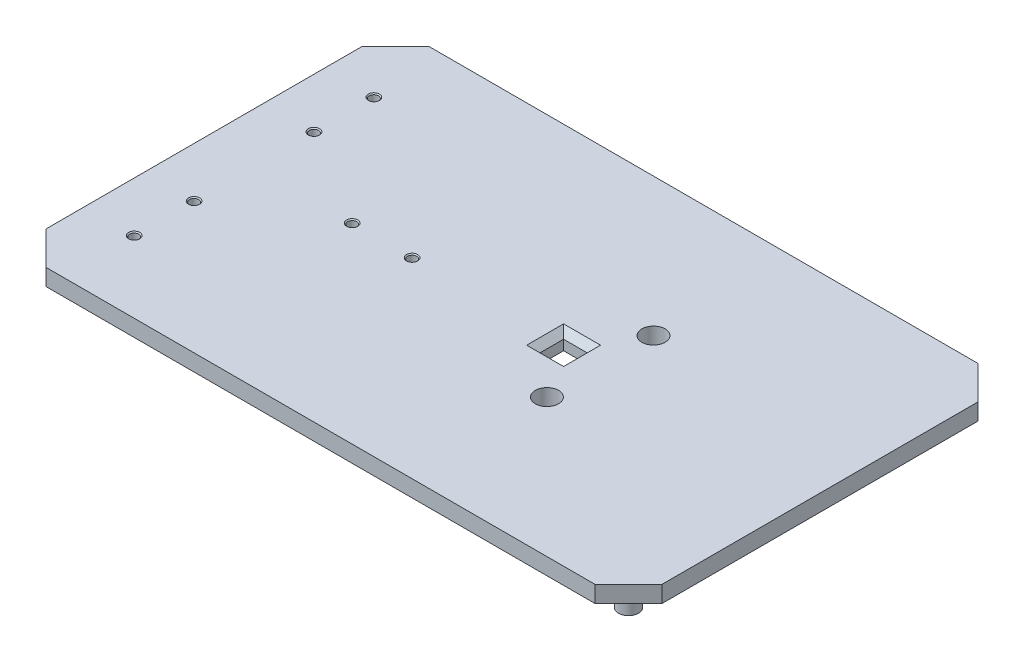
ISO-10303-21;
HEADER;
FILE_DESCRIPTION(('STEP AP214'),'2;1');
FILE_NAME('part.step','',(''),(''),'','','');
FILE_SCHEMA(('AUTOMOTIVE_DESIGN { 1 0 10303 214 1 1 1 1 }'));
ENDSEC;
DATA;
#1=APPLICATION_CONTEXT('core data for automotive mechanical design processes');
#2=APPLICATION_PROTOCOL_DEFINITION('international standard','automotive_design',2000,#1);
#3=PRODUCT_CONTEXT('',#1,'mechanical');
#4=PRODUCT('Part','Part','',(#3));
#5=PRODUCT_RELATED_PRODUCT_CATEGORY('part','',(#4));
#6=PRODUCT_DEFINITION_FORMATION('','',#4);
#7=PRODUCT_DEFINITION_CONTEXT('part definition',#1,'design');
#8=PRODUCT_DEFINITION('design','',#6,#7);
#9=PRODUCT_DEFINITION_SHAPE('','',#8);
#10=(LENGTH_UNIT() NAMED_UNIT(*) SI_UNIT(.MILLI.,.METRE.));
#11=(NAMED_UNIT(*) PLANE_ANGLE_UNIT() SI_UNIT($,.RADIAN.));
#12=(NAMED_UNIT(*) SI_UNIT($,.STERADIAN.) SOLID_ANGLE_UNIT());
#13=UNCERTAINTY_MEASURE_WITH_UNIT(LENGTH_MEASURE(1.E-05),#10,'distance_accuracy_value','');
#14=(GEOMETRIC_REPRESENTATION_CONTEXT(3) GLOBAL_UNCERTAINTY_ASSIGNED_CONTEXT((#13)) GLOBAL_UNIT_ASSIGNED_CONTEXT((#10,
#11,#12)) REPRESENTATION_CONTEXT('',''));
#15=CARTESIAN_POINT('',(0.,0.,0.));
#16=DIRECTION('',(0.,0.,1.));
#17=DIRECTION('',(1.,0.,0.));
#18=AXIS2_PLACEMENT_3D('',#15,#16,#17);
#19=CARTESIAN_POINT('',(0.,5.,0.));
#20=DIRECTION('',(0.,1.,0.));
#21=DIRECTION('',(0.,0.,1.));
#22=AXIS2_PLACEMENT_3D('',#19,#20,#21);
#23=PLANE('',#22);
#24=DIRECTION('',(0.,0.,1.));
#25=VECTOR('',#24,1.);
#26=CARTESIAN_POINT('',(21.05,5.,0.));
#27=LINE('',#26,#25);
#28=CARTESIAN_POINT('',(21.05,5.,-5.55000000000001));
#29=VERTEX_POINT('',#28);
#30=CARTESIAN_POINT('',(21.05,5.,5.54999999999999));
#31=VERTEX_POINT('',#30);
#32=EDGE_CURVE('E166',#29,#31,#27,.T.);
#33=ORIENTED_EDGE('',*,*,#32,.T.);
#34=DIRECTION('',(-1.,0.,0.));
#35=VECTOR('',#34,1.);
#36=CARTESIAN_POINT('',(0.,5.,5.55));
#37=LINE('',#36,#35);
#38=CARTESIAN_POINT('',(9.95,5.,5.54999999999999));
#39=VERTEX_POINT('',#38);
#40=EDGE_CURVE('E172',#31,#39,#37,.T.);
#41=ORIENTED_EDGE('',*,*,#40,.T.);
#42=DIRECTION('',(0.,0.,-1.));
#43=VECTOR('',#42,1.);
#44=CARTESIAN_POINT('',(9.95,5.,0.));
#45=LINE('',#44,#43);
#46=CARTESIAN_POINT('',(9.95,5.,-5.55));
#47=VERTEX_POINT('',#46);
#48=EDGE_CURVE('E170',#39,#47,#45,.T.);
#49=ORIENTED_EDGE('',*,*,#48,.T.);
#50=DIRECTION('',(1.,0.,0.));
#51=VECTOR('',#50,1.);
#52=CARTESIAN_POINT('',(0.,5.,-5.55));
#53=LINE('',#52,#51);
#54=EDGE_CURVE('E168',#47,#29,#53,.T.);
#55=ORIENTED_EDGE('',*,*,#54,.T.);
#56=EDGE_LOOP('',(#33,#41,#49,#55));
#57=FACE_BOUND('',#56,.T.);
#58=CARTESIAN_POINT('',(26.5,5.,-16.));
#59=DIRECTION('',(0.,1.,0.));
#60=DIRECTION('',(0.,0.,1.));
#61=AXIS2_PLACEMENT_3D('',#58,#59,#60);
#62=CIRCLE('',#61,3.5);
#63=CARTESIAN_POINT('',(26.5,5.,-12.5));
#64=VERTEX_POINT('',#63);
#65=EDGE_CURVE('E199',#64,#64,#62,.F.);
#66=ORIENTED_EDGE('',*,*,#65,.T.);
#67=EDGE_LOOP('',(#66));
#68=FACE_BOUND('',#67,.T.);
#69=CARTESIAN_POINT('',(26.5,5.,16.));
#70=DIRECTION('',(0.,1.,0.));
#71=DIRECTION('',(0.,0.,1.));
#72=AXIS2_PLACEMENT_3D('',#69,#70,#71);
#73=CIRCLE('',#72,3.5);
#74=CARTESIAN_POINT('',(26.5,5.,19.5));
#75=VERTEX_POINT('',#74);
#76=EDGE_CURVE('E203',#75,#75,#73,.F.);
#77=ORIENTED_EDGE('',*,*,#76,.T.);
#78=EDGE_LOOP('',(#77));
#79=FACE_BOUND('',#78,.T.);
#80=CARTESIAN_POINT('',(-77.5,5.,36.));
#81=DIRECTION('',(0.,1.,0.));
#82=DIRECTION('',(0.,0.,1.));
#83=AXIS2_PLACEMENT_3D('',#80,#81,#82);
#84=CIRCLE('',#83,1.67500000000001);
#85=CARTESIAN_POINT('',(-77.5,5.,37.675));
#86=VERTEX_POINT('',#85);
#87=EDGE_CURVE('E288',#86,#86,#84,.F.);
#88=ORIENTED_EDGE('',*,*,#87,.T.);
#89=EDGE_LOOP('',(#88));
#90=FACE_BOUND('',#89,.T.);
#91=CARTESIAN_POINT('',(-77.5,5.,18.));
#92=DIRECTION('',(0.,1.,0.));
#93=DIRECTION('',(0.,0.,1.));
#94=AXIS2_PLACEMENT_3D('',#91,#92,#93);
#95=CIRCLE('',#94,1.67499999999995);
#96=CARTESIAN_POINT('',(-77.5,5.,19.675));
#97=VERTEX_POINT('',#96);
#98=EDGE_CURVE('E285',#97,#97,#95,.F.);
#99=ORIENTED_EDGE('',*,*,#98,.T.);
#100=EDGE_LOOP('',(#99));
#101=FACE_BOUND('',#100,.T.);
#102=CARTESIAN_POINT('',(-77.5,5.,-36.));
#103=DIRECTION('',(0.,1.,0.));
#104=DIRECTION('',(0.,0.,1.));
#105=AXIS2_PLACEMENT_3D('',#102,#103,#104);
#106=CIRCLE('',#105,1.67499999999995);
#107=CARTESIAN_POINT('',(-77.5,5.,-34.325));
#108=VERTEX_POINT('',#107);
#109=EDGE_CURVE('E282',#108,#108,#106,.F.);
#110=ORIENTED_EDGE('',*,*,#109,.T.);
#111=EDGE_LOOP('',(#110));
#112=FACE_BOUND('',#111,.T.);
#113=CARTESIAN_POINT('',(-77.5,5.,-18.));
#114=DIRECTION('',(0.,1.,0.));
#115=DIRECTION('',(0.,0.,1.));
#116=AXIS2_PLACEMENT_3D('',#113,#114,#115);
#117=CIRCLE('',#116,1.67500000000001);
#118=CARTESIAN_POINT('',(-77.5,5.,-16.325));
#119=VERTEX_POINT('',#118);
#120=EDGE_CURVE('E279',#119,#119,#117,.F.);
#121=ORIENTED_EDGE('',*,*,#120,.T.);
#122=EDGE_LOOP('',(#121));
#123=FACE_BOUND('',#122,.T.);
#124=CARTESIAN_POINT('',(-48.,5.,0.));
#125=DIRECTION('',(0.,1.,0.));
#126=DIRECTION('',(0.,0.,1.));
#127=AXIS2_PLACEMENT_3D('',#124,#125,#126);
#128=CIRCLE('',#127,1.67500000000001);
#129=CARTESIAN_POINT('',(-48.,5.,1.67500000000001));
#130=VERTEX_POINT('',#129);
#131=EDGE_CURVE('E276',#130,#130,#128,.F.);
#132=ORIENTED_EDGE('',*,*,#131,.T.);
#133=EDGE_LOOP('',(#132));
#134=FACE_BOUND('',#133,.T.);
#135=CARTESIAN_POINT('',(-30.,5.,0.));
#136=DIRECTION('',(0.,1.,0.));
#137=DIRECTION('',(0.,0.,1.));
#138=AXIS2_PLACEMENT_3D('',#135,#136,#137);
#139=CIRCLE('',#138,1.67500000000001);
#140=CARTESIAN_POINT('',(-30.,5.,1.67500000000001));
#141=VERTEX_POINT('',#140);
#142=EDGE_CURVE('E273',#141,#141,#139,.F.);
#143=ORIENTED_EDGE('',*,*,#142,.T.);
#144=EDGE_LOOP('',(#143));
#145=FACE_BOUND('',#144,.T.);
#146=DIRECTION('',(1.,0.,0.));
#147=VECTOR('',#146,1.);
#148=CARTESIAN_POINT('',(-92.5,5.,57.5));
#149=LINE('',#148,#147);
#150=CARTESIAN_POINT('',(-82.5,5.,57.5));
#151=VERTEX_POINT('',#150);
#152=CARTESIAN_POINT('',(82.4999999999999,5.,57.5));
#153=VERTEX_POINT('',#152);
#154=EDGE_CURVE('E232',#151,#153,#149,.T.);
#155=ORIENTED_EDGE('',*,*,#154,.T.);
#156=DIRECTION('',(0.707106781186549,0.,-0.707106781186546));
#157=VECTOR('',#156,1.);
#158=CARTESIAN_POINT('',(69.9999999999998,5.,70.0000000000001));
#159=LINE('',#158,#157);
#160=CARTESIAN_POINT('',(92.5,5.,47.5));
#161=VERTEX_POINT('',#160);
#162=EDGE_CURVE('E346',#153,#161,#159,.T.);
#163=ORIENTED_EDGE('',*,*,#162,.T.);
#164=DIRECTION('',(0.,0.,1.));
#165=VECTOR('',#164,1.);
#166=CARTESIAN_POINT('',(92.5,5.,-57.5));
#167=LINE('',#166,#165);
#168=CARTESIAN_POINT('',(92.5,5.,-47.5));
#169=VERTEX_POINT('',#168);
#170=EDGE_CURVE('E236',#169,#161,#167,.T.);
#171=ORIENTED_EDGE('',*,*,#170,.F.);
#172=DIRECTION('',(0.707106781186547,0.,0.707106781186549));
#173=VECTOR('',#172,1.);
#174=CARTESIAN_POINT('',(70.0000000000001,5.,-69.9999999999999));
#175=LINE('',#174,#173);
#176=CARTESIAN_POINT('',(82.5,5.,-57.5));
#177=VERTEX_POINT('',#176);
#178=EDGE_CURVE('E344',#169,#177,#175,.F.);
#179=ORIENTED_EDGE('',*,*,#178,.T.);
#180=DIRECTION('',(1.,0.,0.));
#181=VECTOR('',#180,1.);
#182=CARTESIAN_POINT('',(-92.5,5.,-57.5));
#183=LINE('',#182,#181);
#184=CARTESIAN_POINT('',(-82.5,5.,-57.5));
#185=VERTEX_POINT('',#184);
#186=EDGE_CURVE('E239',#185,#177,#183,.T.);
#187=ORIENTED_EDGE('',*,*,#186,.F.);
#188=DIRECTION('',(-0.707106781186549,0.,0.707106781186547));
#189=VECTOR('',#188,1.);
#190=CARTESIAN_POINT('',(-69.9999999999999,5.,-70.0000000000001));
#191=LINE('',#190,#189);
#192=CARTESIAN_POINT('',(-92.5,5.,-47.5));
#193=VERTEX_POINT('',#192);
#194=EDGE_CURVE('E340',#185,#193,#191,.T.);
#195=ORIENTED_EDGE('',*,*,#194,.T.);
#196=DIRECTION('',(0.,0.,1.));
#197=VECTOR('',#196,1.);
#198=CARTESIAN_POINT('',(-92.5,5.,-57.5));
#199=LINE('',#198,#197);
#200=CARTESIAN_POINT('',(-92.5,5.,47.4999999999999));
#201=VERTEX_POINT('',#200);
#202=EDGE_CURVE('E229',#193,#201,#199,.T.);
#203=ORIENTED_EDGE('',*,*,#202,.T.);
#204=DIRECTION('',(-0.707106781186547,0.,-0.707106781186549));
#205=VECTOR('',#204,1.);
#206=CARTESIAN_POINT('',(-70.0000000000001,5.,69.9999999999999));
#207=LINE('',#206,#205);
#208=EDGE_CURVE('E342',#201,#151,#207,.F.);
#209=ORIENTED_EDGE('',*,*,#208,.T.);
#210=EDGE_LOOP('',(#155,#163,#171,#179,#187,#195,#203,#209));
#211=FACE_BOUND('',#210,.T.);
#212=ADVANCED_FACE('F34',(#57,#68,#79,#90,#101,#112,#123,#134,#145,#211),#23,.T.);
#213=CARTESIAN_POINT('',(0.,0.,0.));
#214=DIRECTION('',(0.,1.,0.));
#215=DIRECTION('',(0.,0.,1.));
#216=AXIS2_PLACEMENT_3D('',#213,#214,#215);
#217=PLANE('',#216);
#218=DIRECTION('',(0.,0.,1.));
#219=VECTOR('',#218,1.);
#220=CARTESIAN_POINT('',(92.5,0.,-57.5));
#221=LINE('',#220,#219);
#222=CARTESIAN_POINT('',(92.5,0.,-47.5));
#223=VERTEX_POINT('',#222);
#224=CARTESIAN_POINT('',(92.5,0.,47.5));
#225=VERTEX_POINT('',#224);
#226=EDGE_CURVE('E250',#223,#225,#221,.T.);
#227=ORIENTED_EDGE('',*,*,#226,.T.);
#228=DIRECTION('',(-0.707106781186549,0.,0.707106781186546));
#229=VECTOR('',#228,1.);
#230=CARTESIAN_POINT('',(92.5,0.,47.5));
#231=LINE('',#230,#229);
#232=CARTESIAN_POINT('',(82.4999999999999,0.,57.5));
#233=VERTEX_POINT('',#232);
#234=EDGE_CURVE('E333',#225,#233,#231,.T.);
#235=ORIENTED_EDGE('',*,*,#234,.T.);
#236=DIRECTION('',(1.,0.,0.));
#237=VECTOR('',#236,1.);
#238=CARTESIAN_POINT('',(-92.5,0.,57.5));
#239=LINE('',#238,#237);
#240=CARTESIAN_POINT('',(-82.4999999999999,0.,57.5));
#241=VERTEX_POINT('',#240);
#242=EDGE_CURVE('E246',#241,#233,#239,.T.);
#243=ORIENTED_EDGE('',*,*,#242,.F.);
#244=DIRECTION('',(0.707106781186547,0.,0.707106781186549));
#245=VECTOR('',#244,1.);
#246=CARTESIAN_POINT('',(-82.4999999999999,0.,57.5));
#247=LINE('',#246,#245);
#248=CARTESIAN_POINT('',(-92.5,0.,47.4999999999999));
#249=VERTEX_POINT('',#248);
#250=EDGE_CURVE('E329',#241,#249,#247,.F.);
#251=ORIENTED_EDGE('',*,*,#250,.T.);
#252=DIRECTION('',(0.,0.,1.));
#253=VECTOR('',#252,1.);
#254=CARTESIAN_POINT('',(-92.5,0.,-57.5));
#255=LINE('',#254,#253);
#256=CARTESIAN_POINT('',(-92.5,0.,-47.5));
#257=VERTEX_POINT('',#256);
#258=EDGE_CURVE('E243',#257,#249,#255,.T.);
#259=ORIENTED_EDGE('',*,*,#258,.F.);
#260=DIRECTION('',(0.707106781186549,0.,-0.707106781186547));
#261=VECTOR('',#260,1.);
#262=CARTESIAN_POINT('',(-92.5,0.,-47.5));
#263=LINE('',#262,#261);
#264=CARTESIAN_POINT('',(-82.5,0.,-57.5));
#265=VERTEX_POINT('',#264);
#266=EDGE_CURVE('E327',#257,#265,#263,.T.);
#267=ORIENTED_EDGE('',*,*,#266,.T.);
#268=DIRECTION('',(1.,0.,0.));
#269=VECTOR('',#268,1.);
#270=CARTESIAN_POINT('',(-92.5,0.,-57.5));
#271=LINE('',#270,#269);
#272=CARTESIAN_POINT('',(82.5,0.,-57.5));
#273=VERTEX_POINT('',#272);
#274=EDGE_CURVE('E233',#265,#273,#271,.T.);
#275=ORIENTED_EDGE('',*,*,#274,.T.);
#276=DIRECTION('',(-0.707106781186547,0.,-0.707106781186549));
#277=VECTOR('',#276,1.);
#278=CARTESIAN_POINT('',(82.5,0.,-57.5));
#279=LINE('',#278,#277);
#280=EDGE_CURVE('E331',#273,#223,#279,.F.);
#281=ORIENTED_EDGE('',*,*,#280,.T.);
#282=EDGE_LOOP('',(#227,#235,#243,#251,#259,#267,#275,#281));
#283=FACE_BOUND('',#282,.T.);
#284=CARTESIAN_POINT('',(-77.5,0.,-36.));
#285=DIRECTION('',(0.,1.,0.));
#286=DIRECTION('',(0.,0.,1.));
#287=AXIS2_PLACEMENT_3D('',#284,#285,#286);
#288=CIRCLE('',#287,1.375);
#289=CARTESIAN_POINT('',(-77.5,0.,-34.625));
#290=VERTEX_POINT('',#289);
#291=EDGE_CURVE('E247',#290,#290,#288,.T.);
#292=ORIENTED_EDGE('',*,*,#291,.T.);
#293=EDGE_LOOP('',(#292));
#294=FACE_BOUND('',#293,.T.);
#295=CARTESIAN_POINT('',(-77.5,0.,-18.));
#296=DIRECTION('',(0.,1.,0.));
#297=DIRECTION('',(0.,0.,1.));
#298=AXIS2_PLACEMENT_3D('',#295,#296,#297);
#299=CIRCLE('',#298,1.375);
#300=CARTESIAN_POINT('',(-77.5,0.,-16.625));
#301=VERTEX_POINT('',#300);
#302=EDGE_CURVE('E257',#301,#301,#299,.T.);
#303=ORIENTED_EDGE('',*,*,#302,.T.);
#304=EDGE_LOOP('',(#303));
#305=FACE_BOUND('',#304,.T.);
#306=CARTESIAN_POINT('',(-77.5,0.,18.));
#307=DIRECTION('',(0.,1.,0.));
#308=DIRECTION('',(0.,0.,1.));
#309=AXIS2_PLACEMENT_3D('',#306,#307,#308);
#310=CIRCLE('',#309,1.375);
#311=CARTESIAN_POINT('',(-77.5,0.,19.375));
#312=VERTEX_POINT('',#311);
#313=EDGE_CURVE('E260',#312,#312,#310,.T.);
#314=ORIENTED_EDGE('',*,*,#313,.T.);
#315=EDGE_LOOP('',(#314));
#316=FACE_BOUND('',#315,.T.);
#317=CARTESIAN_POINT('',(-77.5,0.,36.));
#318=DIRECTION('',(0.,1.,0.));
#319=DIRECTION('',(0.,0.,1.));
#320=AXIS2_PLACEMENT_3D('',#317,#318,#319);
#321=CIRCLE('',#320,1.375);
#322=CARTESIAN_POINT('',(-77.5,0.,37.375));
#323=VERTEX_POINT('',#322);
#324=EDGE_CURVE('E263',#323,#323,#321,.T.);
#325=ORIENTED_EDGE('',*,*,#324,.T.);
#326=EDGE_LOOP('',(#325));
#327=FACE_BOUND('',#326,.T.);
#328=CARTESIAN_POINT('',(-48.,0.,0.));
#329=DIRECTION('',(0.,1.,0.));
#330=DIRECTION('',(0.,0.,1.));
#331=AXIS2_PLACEMENT_3D('',#328,#329,#330);
#332=CIRCLE('',#331,1.375);
#333=CARTESIAN_POINT('',(-48.,0.,1.375));
#334=VERTEX_POINT('',#333);
#335=EDGE_CURVE('E266',#334,#334,#332,.T.);
#336=ORIENTED_EDGE('',*,*,#335,.T.);
#337=EDGE_LOOP('',(#336));
#338=FACE_BOUND('',#337,.T.);
#339=CARTESIAN_POINT('',(-30.,0.,0.));
#340=DIRECTION('',(0.,1.,0.));
#341=DIRECTION('',(0.,0.,1.));
#342=AXIS2_PLACEMENT_3D('',#339,#340,#341);
#343=CIRCLE('',#342,1.375);
#344=CARTESIAN_POINT('',(-30.,0.,1.375));
#345=VERTEX_POINT('',#344);
#346=EDGE_CURVE('E226',#345,#345,#343,.T.);
#347=ORIENTED_EDGE('',*,*,#346,.T.);
#348=EDGE_LOOP('',(#347));
#349=FACE_BOUND('',#348,.T.);
#350=CARTESIAN_POINT('',(82.5,0.,-47.5));
#351=DIRECTION('',(0.,1.,0.));
#352=DIRECTION('',(0.,0.,1.));
#353=AXIS2_PLACEMENT_3D('',#350,#351,#352);
#354=CIRCLE('',#353,3.00000000000001);
#355=CARTESIAN_POINT('',(82.5,0.,-44.5));
#356=VERTEX_POINT('',#355);
#357=EDGE_CURVE('E220',#356,#356,#354,.T.);
#358=ORIENTED_EDGE('',*,*,#357,.T.);
#359=EDGE_LOOP('',(#358));
#360=FACE_BOUND('',#359,.T.);
#361=CARTESIAN_POINT('',(82.5,0.,47.5));
#362=DIRECTION('',(0.,1.,0.));
#363=DIRECTION('',(0.,0.,1.));
#364=AXIS2_PLACEMENT_3D('',#361,#362,#363);
#365=CIRCLE('',#364,3.00000000000001);
#366=CARTESIAN_POINT('',(82.5,0.,50.5));
#367=VERTEX_POINT('',#366);
#368=EDGE_CURVE('E217',#367,#367,#365,.T.);
#369=ORIENTED_EDGE('',*,*,#368,.T.);
#370=EDGE_LOOP('',(#369));
#371=FACE_BOUND('',#370,.T.);
#372=CARTESIAN_POINT('',(26.5,0.,16.));
#373=DIRECTION('',(0.,1.,0.));
#374=DIRECTION('',(0.,0.,1.));
#375=AXIS2_PLACEMENT_3D('',#372,#373,#374);
#376=CIRCLE('',#375,4.);
#377=CARTESIAN_POINT('',(26.5,0.,20.));
#378=VERTEX_POINT('',#377);
#379=EDGE_CURVE('E207',#378,#378,#376,.T.);
#380=ORIENTED_EDGE('',*,*,#379,.T.);
#381=EDGE_LOOP('',(#380));
#382=FACE_BOUND('',#381,.T.);
#383=CARTESIAN_POINT('',(26.5,0.,-16.));
#384=DIRECTION('',(0.,1.,0.));
#385=DIRECTION('',(0.,0.,1.));
#386=AXIS2_PLACEMENT_3D('',#383,#384,#385);
#387=CIRCLE('',#386,4.);
#388=CARTESIAN_POINT('',(26.5,0.,-12.));
#389=VERTEX_POINT('',#388);
#390=EDGE_CURVE('E208',#389,#389,#387,.T.);
#391=ORIENTED_EDGE('',*,*,#390,.T.);
#392=EDGE_LOOP('',(#391));
#393=FACE_BOUND('',#392,.T.);
#394=DIRECTION('',(0.,0.,1.));
#395=VECTOR('',#394,1.);
#396=CARTESIAN_POINT('',(19.05,0.,0.));
#397=LINE('',#396,#395);
#398=CARTESIAN_POINT('',(19.05,0.,-3.55000000000001));
#399=VERTEX_POINT('',#398);
#400=CARTESIAN_POINT('',(19.05,0.,3.54999999999999));
#401=VERTEX_POINT('',#400);
#402=EDGE_CURVE('E161',#399,#401,#397,.T.);
#403=ORIENTED_EDGE('',*,*,#402,.F.);
#404=DIRECTION('',(1.,0.,0.));
#405=VECTOR('',#404,1.);
#406=CARTESIAN_POINT('',(0.,0.,-3.55));
#407=LINE('',#406,#405);
#408=CARTESIAN_POINT('',(11.95,0.,-3.55));
#409=VERTEX_POINT('',#408);
#410=EDGE_CURVE('E159',#409,#399,#407,.T.);
#411=ORIENTED_EDGE('',*,*,#410,.F.);
#412=DIRECTION('',(0.,0.,-1.));
#413=VECTOR('',#412,1.);
#414=CARTESIAN_POINT('',(11.95,0.,0.));
#415=LINE('',#414,#413);
#416=CARTESIAN_POINT('',(11.95,0.,3.54999999999999));
#417=VERTEX_POINT('',#416);
#418=EDGE_CURVE('E139',#417,#409,#415,.T.);
#419=ORIENTED_EDGE('',*,*,#418,.F.);
#420=DIRECTION('',(-1.,0.,0.));
#421=VECTOR('',#420,1.);
#422=CARTESIAN_POINT('',(0.,0.,3.54999999999999));
#423=LINE('',#422,#421);
#424=EDGE_CURVE('E150',#401,#417,#423,.T.);
#425=ORIENTED_EDGE('',*,*,#424,.F.);
#426=EDGE_LOOP('',(#403,#411,#419,#425));
#427=FACE_BOUND('',#426,.T.);
#428=ADVANCED_FACE('F157',(#283,#294,#305,#316,#327,#338,#349,#360,#371,#382,#393,#427),#217,.F.);
#429=CARTESIAN_POINT('',(-92.5,5.,-57.5));
#430=DIRECTION('',(1.,0.,0.));
#431=DIRECTION('',(0.,0.,-1.));
#432=AXIS2_PLACEMENT_3D('',#429,#430,#431);
#433=PLANE('',#432);
#434=ORIENTED_EDGE('',*,*,#258,.T.);
#435=DIRECTION('',(0.,1.,0.));
#436=VECTOR('',#435,1.);
#437=CARTESIAN_POINT('',(-92.5,5.,47.4999999999999));
#438=LINE('',#437,#436);
#439=EDGE_CURVE('E155',#249,#201,#438,.T.);
#440=ORIENTED_EDGE('',*,*,#439,.T.);
#441=ORIENTED_EDGE('',*,*,#202,.F.);
#442=DIRECTION('',(0.,-1.,0.));
#443=VECTOR('',#442,1.);
#444=CARTESIAN_POINT('',(-92.5,0.,-47.5));
#445=LINE('',#444,#443);
#446=EDGE_CURVE('E353',#193,#257,#445,.T.);
#447=ORIENTED_EDGE('',*,*,#446,.T.);
#448=EDGE_LOOP('',(#434,#440,#441,#447));
#449=FACE_BOUND('',#448,.T.);
#450=ADVANCED_FACE('F358',(#449),#433,.F.);
#451=CARTESIAN_POINT('',(-92.5,5.,57.5));
#452=DIRECTION('',(0.,0.,-1.));
#453=DIRECTION('',(-1.,0.,0.));
#454=AXIS2_PLACEMENT_3D('',#451,#452,#453);
#455=PLANE('',#454);
#456=ORIENTED_EDGE('',*,*,#242,.T.);
#457=DIRECTION('',(0.,1.,0.));
#458=VECTOR('',#457,1.);
#459=CARTESIAN_POINT('',(82.4999999999999,5.,57.5));
#460=LINE('',#459,#458);
#461=EDGE_CURVE('E338',#233,#153,#460,.T.);
#462=ORIENTED_EDGE('',*,*,#461,.T.);
#463=ORIENTED_EDGE('',*,*,#154,.F.);
#464=DIRECTION('',(0.,-1.,0.));
#465=VECTOR('',#464,1.);
#466=CARTESIAN_POINT('',(-82.4999999999999,5.,57.5));
#467=LINE('',#466,#465);
#468=EDGE_CURVE('E335',#151,#241,#467,.T.);
#469=ORIENTED_EDGE('',*,*,#468,.T.);
#470=EDGE_LOOP('',(#456,#462,#463,#469));
#471=FACE_BOUND('',#470,.T.);
#472=ADVANCED_FACE('F371',(#471),#455,.F.);
#473=CARTESIAN_POINT('',(92.5,5.,-57.5));
#474=DIRECTION('',(1.,0.,0.));
#475=DIRECTION('',(0.,0.,-1.));
#476=AXIS2_PLACEMENT_3D('',#473,#474,#475);
#477=PLANE('',#476);
#478=ORIENTED_EDGE('',*,*,#170,.T.);
#479=DIRECTION('',(0.,-1.,0.));
#480=VECTOR('',#479,1.);
#481=CARTESIAN_POINT('',(92.5,0.,47.5));
#482=LINE('',#481,#480);
#483=EDGE_CURVE('E324',#161,#225,#482,.T.);
#484=ORIENTED_EDGE('',*,*,#483,.T.);
#485=ORIENTED_EDGE('',*,*,#226,.F.);
#486=DIRECTION('',(0.,1.,0.));
#487=VECTOR('',#486,1.);
#488=CARTESIAN_POINT('',(92.5,5.,-47.5));
#489=LINE('',#488,#487);
#490=EDGE_CURVE('E322',#223,#169,#489,.T.);
#491=ORIENTED_EDGE('',*,*,#490,.T.);
#492=EDGE_LOOP('',(#478,#484,#485,#491));
#493=FACE_BOUND('',#492,.T.);
#494=ADVANCED_FACE('F381',(#493),#477,.T.);
#495=CARTESIAN_POINT('',(-92.5,5.,-57.5));
#496=DIRECTION('',(0.,0.,-1.));
#497=DIRECTION('',(-1.,0.,0.));
#498=AXIS2_PLACEMENT_3D('',#495,#496,#497);
#499=PLANE('',#498);
#500=ORIENTED_EDGE('',*,*,#186,.T.);
#501=DIRECTION('',(0.,-1.,0.));
#502=VECTOR('',#501,1.);
#503=CARTESIAN_POINT('',(82.5,5.,-57.5));
#504=LINE('',#503,#502);
#505=EDGE_CURVE('E350',#177,#273,#504,.T.);
#506=ORIENTED_EDGE('',*,*,#505,.T.);
#507=ORIENTED_EDGE('',*,*,#274,.F.);
#508=DIRECTION('',(0.,1.,0.));
#509=VECTOR('',#508,1.);
#510=CARTESIAN_POINT('',(-82.5,5.,-57.5));
#511=LINE('',#510,#509);
#512=EDGE_CURVE('E348',#265,#185,#511,.T.);
#513=ORIENTED_EDGE('',*,*,#512,.T.);
#514=EDGE_LOOP('',(#500,#506,#507,#513));
#515=FACE_BOUND('',#514,.T.);
#516=ADVANCED_FACE('F390',(#515),#499,.T.);
#517=CARTESIAN_POINT('',(-77.5,-15.,-36.));
#518=DIRECTION('',(0.,1.,0.));
#519=DIRECTION('',(0.,0.,1.));
#520=AXIS2_PLACEMENT_3D('',#517,#518,#519);
#521=CYLINDRICAL_SURFACE('',#520,1.375);
#522=CARTESIAN_POINT('',(-77.5,4.70000000000005,-36.));
#523=DIRECTION('',(0.,1.,0.));
#524=DIRECTION('',(0.,0.,1.));
#525=AXIS2_PLACEMENT_3D('',#522,#523,#524);
#526=CIRCLE('',#525,1.375);
#527=CARTESIAN_POINT('',(-77.5,4.70000000000005,-34.625));
#528=VERTEX_POINT('',#527);
#529=EDGE_CURVE('E294',#528,#528,#526,.T.);
#530=ORIENTED_EDGE('',*,*,#529,.T.);
#531=EDGE_LOOP('',(#530));
#532=FACE_BOUND('',#531,.T.);
#533=ORIENTED_EDGE('',*,*,#291,.F.);
#534=EDGE_LOOP('',(#533));
#535=FACE_BOUND('',#534,.T.);
#536=ADVANCED_FACE('F416',(#532,#535),#521,.F.);
#537=CARTESIAN_POINT('',(-77.5,-15.,-18.));
#538=DIRECTION('',(0.,1.,0.));
#539=DIRECTION('',(0.,0.,1.));
#540=AXIS2_PLACEMENT_3D('',#537,#538,#539);
#541=CYLINDRICAL_SURFACE('',#540,1.375);
#542=CARTESIAN_POINT('',(-77.5,4.69999999999999,-18.));
#543=DIRECTION('',(0.,1.,0.));
#544=DIRECTION('',(0.,0.,1.));
#545=AXIS2_PLACEMENT_3D('',#542,#543,#544);
#546=CIRCLE('',#545,1.375);
#547=CARTESIAN_POINT('',(-77.5,4.69999999999999,-16.625));
#548=VERTEX_POINT('',#547);
#549=EDGE_CURVE('E297',#548,#548,#546,.T.);
#550=ORIENTED_EDGE('',*,*,#549,.T.);
#551=EDGE_LOOP('',(#550));
#552=FACE_BOUND('',#551,.T.);
#553=ORIENTED_EDGE('',*,*,#302,.F.);
#554=EDGE_LOOP('',(#553));
#555=FACE_BOUND('',#554,.T.);
#556=ADVANCED_FACE('F617',(#552,#555),#541,.F.);
#557=CARTESIAN_POINT('',(-77.5,-15.,18.));
#558=DIRECTION('',(0.,1.,0.));
#559=DIRECTION('',(0.,0.,1.));
#560=AXIS2_PLACEMENT_3D('',#557,#558,#559);
#561=CYLINDRICAL_SURFACE('',#560,1.375);
#562=CARTESIAN_POINT('',(-77.5,4.70000000000005,18.));
#563=DIRECTION('',(0.,1.,0.));
#564=DIRECTION('',(0.,0.,1.));
#565=AXIS2_PLACEMENT_3D('',#562,#563,#564);
#566=CIRCLE('',#565,1.375);
#567=CARTESIAN_POINT('',(-77.5,4.70000000000005,19.375));
#568=VERTEX_POINT('',#567);
#569=EDGE_CURVE('E291',#568,#568,#566,.T.);
#570=ORIENTED_EDGE('',*,*,#569,.T.);
#571=EDGE_LOOP('',(#570));
#572=FACE_BOUND('',#571,.T.);
#573=ORIENTED_EDGE('',*,*,#313,.F.);
#574=EDGE_LOOP('',(#573));
#575=FACE_BOUND('',#574,.T.);
#576=ADVANCED_FACE('F614',(#572,#575),#561,.F.);
#577=CARTESIAN_POINT('',(-77.5,-15.,36.));
#578=DIRECTION('',(0.,1.,0.));
#579=DIRECTION('',(0.,0.,1.));
#580=AXIS2_PLACEMENT_3D('',#577,#578,#579);
#581=CYLINDRICAL_SURFACE('',#580,1.375);
#582=CARTESIAN_POINT('',(-77.5,4.69999999999999,36.));
#583=DIRECTION('',(0.,1.,0.));
#584=DIRECTION('',(0.,0.,1.));
#585=AXIS2_PLACEMENT_3D('',#582,#583,#584);
#586=CIRCLE('',#585,1.375);
#587=CARTESIAN_POINT('',(-77.5,4.69999999999999,37.375));
#588=VERTEX_POINT('',#587);
#589=EDGE_CURVE('E242',#588,#588,#586,.T.);
#590=ORIENTED_EDGE('',*,*,#589,.T.);
#591=EDGE_LOOP('',(#590));
#592=FACE_BOUND('',#591,.T.);
#593=ORIENTED_EDGE('',*,*,#324,.F.);
#594=EDGE_LOOP('',(#593));
#595=FACE_BOUND('',#594,.T.);
#596=ADVANCED_FACE('F610',(#592,#595),#581,.F.);
#597=CARTESIAN_POINT('',(-48.,-15.,0.));
#598=DIRECTION('',(0.,1.,0.));
#599=DIRECTION('',(0.,0.,1.));
#600=AXIS2_PLACEMENT_3D('',#597,#598,#599);
#601=CYLINDRICAL_SURFACE('',#600,1.375);
#602=CARTESIAN_POINT('',(-48.,4.69999999999999,0.));
#603=DIRECTION('',(0.,1.,0.));
#604=DIRECTION('',(0.,0.,1.));
#605=AXIS2_PLACEMENT_3D('',#602,#603,#604);
#606=CIRCLE('',#605,1.375);
#607=CARTESIAN_POINT('',(-48.,4.69999999999999,1.375));
#608=VERTEX_POINT('',#607);
#609=EDGE_CURVE('E300',#608,#608,#606,.T.);
#610=ORIENTED_EDGE('',*,*,#609,.T.);
#611=EDGE_LOOP('',(#610));
#612=FACE_BOUND('',#611,.T.);
#613=ORIENTED_EDGE('',*,*,#335,.F.);
#614=EDGE_LOOP('',(#613));
#615=FACE_BOUND('',#614,.T.);
#616=ADVANCED_FACE('F606',(#612,#615),#601,.F.);
#617=CARTESIAN_POINT('',(-30.,-15.,0.));
#618=DIRECTION('',(0.,1.,0.));
#619=DIRECTION('',(0.,0.,1.));
#620=AXIS2_PLACEMENT_3D('',#617,#618,#619);
#621=CYLINDRICAL_SURFACE('',#620,1.375);
#622=CARTESIAN_POINT('',(-30.,4.70000000000002,0.));
#623=DIRECTION('',(0.,1.,0.));
#624=DIRECTION('',(0.,0.,1.));
#625=AXIS2_PLACEMENT_3D('',#622,#623,#624);
#626=CIRCLE('',#625,1.375);
#627=CARTESIAN_POINT('',(-30.,4.70000000000002,1.375));
#628=VERTEX_POINT('',#627);
#629=EDGE_CURVE('E303',#628,#628,#626,.T.);
#630=ORIENTED_EDGE('',*,*,#629,.T.);
#631=EDGE_LOOP('',(#630));
#632=FACE_BOUND('',#631,.T.);
#633=ORIENTED_EDGE('',*,*,#346,.F.);
#634=EDGE_LOOP('',(#633));
#635=FACE_BOUND('',#634,.T.);
#636=ADVANCED_FACE('F431',(#632,#635),#621,.F.);
#637=CARTESIAN_POINT('',(-77.5,4.69999999999999,36.));
#638=DIRECTION('',(0.,1.,0.));
#639=DIRECTION('',(0.,0.,1.));
#640=AXIS2_PLACEMENT_3D('',#637,#638,#639);
#641=CONICAL_SURFACE('',#640,1.375,0.785398163397443);
#642=ORIENTED_EDGE('',*,*,#87,.F.);
#643=EDGE_LOOP('',(#642));
#644=FACE_BOUND('',#643,.T.);
#645=ORIENTED_EDGE('',*,*,#589,.F.);
#646=EDGE_LOOP('',(#645));
#647=FACE_BOUND('',#646,.T.);
#648=ADVANCED_FACE('F427',(#644,#647),#641,.F.);
#649=CARTESIAN_POINT('',(-77.5,4.70000000000005,18.));
#650=DIRECTION('',(0.,1.,0.));
#651=DIRECTION('',(0.,0.,1.));
#652=AXIS2_PLACEMENT_3D('',#649,#650,#651);
#653=CONICAL_SURFACE('',#652,1.375,0.785398163397443);
#654=ORIENTED_EDGE('',*,*,#98,.F.);
#655=EDGE_LOOP('',(#654));
#656=FACE_BOUND('',#655,.T.);
#657=ORIENTED_EDGE('',*,*,#569,.F.);
#658=EDGE_LOOP('',(#657));
#659=FACE_BOUND('',#658,.T.);
#660=ADVANCED_FACE('F430',(#656,#659),#653,.F.);
#661=CARTESIAN_POINT('',(-77.5,4.70000000000005,-36.));
#662=DIRECTION('',(0.,1.,0.));
#663=DIRECTION('',(0.,0.,1.));
#664=AXIS2_PLACEMENT_3D('',#661,#662,#663);
#665=CONICAL_SURFACE('',#664,1.375,0.785398163397443);
#666=ORIENTED_EDGE('',*,*,#109,.F.);
#667=EDGE_LOOP('',(#666));
#668=FACE_BOUND('',#667,.T.);
#669=ORIENTED_EDGE('',*,*,#529,.F.);
#670=EDGE_LOOP('',(#669));
#671=FACE_BOUND('',#670,.T.);
#672=ADVANCED_FACE('F435',(#668,#671),#665,.F.);
#673=CARTESIAN_POINT('',(-77.5,4.69999999999999,-18.));
#674=DIRECTION('',(0.,1.,0.));
#675=DIRECTION('',(0.,0.,1.));
#676=AXIS2_PLACEMENT_3D('',#673,#674,#675);
#677=CONICAL_SURFACE('',#676,1.375,0.785398163397443);
#678=ORIENTED_EDGE('',*,*,#120,.F.);
#679=EDGE_LOOP('',(#678));
#680=FACE_BOUND('',#679,.T.);
#681=ORIENTED_EDGE('',*,*,#549,.F.);
#682=EDGE_LOOP('',(#681));
#683=FACE_BOUND('',#682,.T.);
#684=ADVANCED_FACE('F439',(#680,#683),#677,.F.);
#685=CARTESIAN_POINT('',(-48.,4.69999999999999,0.));
#686=DIRECTION('',(0.,1.,0.));
#687=DIRECTION('',(0.,0.,1.));
#688=AXIS2_PLACEMENT_3D('',#685,#686,#687);
#689=CONICAL_SURFACE('',#688,1.375,0.785398163397443);
#690=ORIENTED_EDGE('',*,*,#131,.F.);
#691=EDGE_LOOP('',(#690));
#692=FACE_BOUND('',#691,.T.);
#693=ORIENTED_EDGE('',*,*,#609,.F.);
#694=EDGE_LOOP('',(#693));
#695=FACE_BOUND('',#694,.T.);
#696=ADVANCED_FACE('F443',(#692,#695),#689,.F.);
#697=CARTESIAN_POINT('',(-30.,4.70000000000002,0.));
#698=DIRECTION('',(0.,1.,0.));
#699=DIRECTION('',(0.,0.,1.));
#700=AXIS2_PLACEMENT_3D('',#697,#698,#699);
#701=CONICAL_SURFACE('',#700,1.375,0.78539816339749);
#702=ORIENTED_EDGE('',*,*,#142,.F.);
#703=EDGE_LOOP('',(#702));
#704=FACE_BOUND('',#703,.T.);
#705=ORIENTED_EDGE('',*,*,#629,.F.);
#706=EDGE_LOOP('',(#705));
#707=FACE_BOUND('',#706,.T.);
#708=ADVANCED_FACE('F447',(#704,#707),#701,.F.);
#709=CARTESIAN_POINT('',(82.5,-6.,-47.5));
#710=DIRECTION('',(0.,1.,0.));
#711=DIRECTION('',(0.,0.,1.));
#712=AXIS2_PLACEMENT_3D('',#709,#710,#711);
#713=CYLINDRICAL_SURFACE('',#712,3.00000000000001);
#714=CARTESIAN_POINT('',(82.5,-6.,-47.5));
#715=DIRECTION('',(0.,1.,0.));
#716=DIRECTION('',(0.,0.,1.));
#717=AXIS2_PLACEMENT_3D('',#714,#715,#716);
#718=CIRCLE('',#717,3.00000000000001);
#719=CARTESIAN_POINT('',(82.5,-6.,-44.5));
#720=VERTEX_POINT('',#719);
#721=EDGE_CURVE('E223',#720,#720,#718,.T.);
#722=ORIENTED_EDGE('',*,*,#721,.T.);
#723=EDGE_LOOP('',(#722));
#724=FACE_BOUND('',#723,.T.);
#725=ORIENTED_EDGE('',*,*,#357,.F.);
#726=EDGE_LOOP('',(#725));
#727=FACE_BOUND('',#726,.T.);
#728=ADVANCED_FACE('F451',(#724,#727),#713,.T.);
#729=CARTESIAN_POINT('',(82.5,-6.,-47.5));
#730=DIRECTION('',(0.,1.,0.));
#731=DIRECTION('',(0.,0.,1.));
#732=AXIS2_PLACEMENT_3D('',#729,#730,#731);
#733=PLANE('',#732);
#734=ORIENTED_EDGE('',*,*,#721,.F.);
#735=EDGE_LOOP('',(#734));
#736=FACE_BOUND('',#735,.T.);
#737=ADVANCED_FACE('F593',(#736),#733,.F.);
#738=CARTESIAN_POINT('',(82.5,-6.,47.5));
#739=DIRECTION('',(0.,1.,0.));
#740=DIRECTION('',(0.,0.,1.));
#741=AXIS2_PLACEMENT_3D('',#738,#739,#740);
#742=CYLINDRICAL_SURFACE('',#741,3.00000000000001);
#743=CARTESIAN_POINT('',(82.5,-6.,47.5));
#744=DIRECTION('',(0.,1.,0.));
#745=DIRECTION('',(0.,0.,1.));
#746=AXIS2_PLACEMENT_3D('',#743,#744,#745);
#747=CIRCLE('',#746,3.00000000000001);
#748=CARTESIAN_POINT('',(82.5,-6.,50.5));
#749=VERTEX_POINT('',#748);
#750=EDGE_CURVE('E214',#749,#749,#747,.T.);
#751=ORIENTED_EDGE('',*,*,#750,.T.);
#752=EDGE_LOOP('',(#751));
#753=FACE_BOUND('',#752,.T.);
#754=ORIENTED_EDGE('',*,*,#368,.F.);
#755=EDGE_LOOP('',(#754));
#756=FACE_BOUND('',#755,.T.);
#757=ADVANCED_FACE('F590',(#753,#756),#742,.T.);
#758=CARTESIAN_POINT('',(82.5,-6.,47.5));
#759=DIRECTION('',(0.,1.,0.));
#760=DIRECTION('',(0.,0.,1.));
#761=AXIS2_PLACEMENT_3D('',#758,#759,#760);
#762=PLANE('',#761);
#763=ORIENTED_EDGE('',*,*,#750,.F.);
#764=EDGE_LOOP('',(#763));
#765=FACE_BOUND('',#764,.T.);
#766=ADVANCED_FACE('F588',(#765),#762,.F.);
#767=CARTESIAN_POINT('',(26.5,-4.,16.));
#768=DIRECTION('',(0.,1.,0.));
#769=DIRECTION('',(0.,0.,1.));
#770=AXIS2_PLACEMENT_3D('',#767,#768,#769);
#771=CYLINDRICAL_SURFACE('',#770,4.);
#772=CARTESIAN_POINT('',(26.5,-4.,16.));
#773=DIRECTION('',(0.,1.,0.));
#774=DIRECTION('',(0.,0.,1.));
#775=AXIS2_PLACEMENT_3D('',#772,#773,#774);
#776=CIRCLE('',#775,4.);
#777=CARTESIAN_POINT('',(26.5,-4.,20.));
#778=VERTEX_POINT('',#777);
#779=EDGE_CURVE('E211',#778,#778,#776,.T.);
#780=ORIENTED_EDGE('',*,*,#779,.T.);
#781=EDGE_LOOP('',(#780));
#782=FACE_BOUND('',#781,.T.);
#783=ORIENTED_EDGE('',*,*,#379,.F.);
#784=EDGE_LOOP('',(#783));
#785=FACE_BOUND('',#784,.T.);
#786=ADVANCED_FACE('F584',(#782,#785),#771,.T.);
#787=CARTESIAN_POINT('',(26.5,-4.,16.));
#788=DIRECTION('',(0.,1.,0.));
#789=DIRECTION('',(0.,0.,1.));
#790=AXIS2_PLACEMENT_3D('',#787,#788,#789);
#791=PLANE('',#790);
#792=CARTESIAN_POINT('',(26.5,-4.,16.));
#793=DIRECTION('',(0.,1.,0.));
#794=DIRECTION('',(0.,0.,1.));
#795=AXIS2_PLACEMENT_3D('',#792,#793,#794);
#796=CIRCLE('',#795,2.00000000000004);
#797=CARTESIAN_POINT('',(26.5,-4.,18.));
#798=VERTEX_POINT('',#797);
#799=EDGE_CURVE('E313',#798,#798,#796,.T.);
#800=ORIENTED_EDGE('',*,*,#799,.T.);
#801=EDGE_LOOP('',(#800));
#802=FACE_BOUND('',#801,.T.);
#803=ORIENTED_EDGE('',*,*,#779,.F.);
#804=EDGE_LOOP('',(#803));
#805=FACE_BOUND('',#804,.T.);
#806=ADVANCED_FACE('F580',(#802,#805),#791,.F.);
#807=CARTESIAN_POINT('',(26.5,-4.,-16.));
#808=DIRECTION('',(0.,1.,0.));
#809=DIRECTION('',(0.,0.,1.));
#810=AXIS2_PLACEMENT_3D('',#807,#808,#809);
#811=CYLINDRICAL_SURFACE('',#810,4.);
#812=CARTESIAN_POINT('',(26.5,-4.,-16.));
#813=DIRECTION('',(0.,1.,0.));
#814=DIRECTION('',(0.,0.,1.));
#815=AXIS2_PLACEMENT_3D('',#812,#813,#814);
#816=CIRCLE('',#815,4.);
#817=CARTESIAN_POINT('',(26.5,-4.,-12.));
#818=VERTEX_POINT('',#817);
#819=EDGE_CURVE('E204',#818,#818,#816,.T.);
#820=ORIENTED_EDGE('',*,*,#819,.T.);
#821=EDGE_LOOP('',(#820));
#822=FACE_BOUND('',#821,.T.);
#823=ORIENTED_EDGE('',*,*,#390,.F.);
#824=EDGE_LOOP('',(#823));
#825=FACE_BOUND('',#824,.T.);
#826=ADVANCED_FACE('F576',(#822,#825),#811,.T.);
#827=CARTESIAN_POINT('',(26.5,-4.,-16.));
#828=DIRECTION('',(0.,1.,0.));
#829=DIRECTION('',(0.,0.,1.));
#830=AXIS2_PLACEMENT_3D('',#827,#828,#829);
#831=PLANE('',#830);
#832=CARTESIAN_POINT('',(26.5,-4.,-16.));
#833=DIRECTION('',(0.,1.,0.));
#834=DIRECTION('',(0.,0.,1.));
#835=AXIS2_PLACEMENT_3D('',#832,#833,#834);
#836=CIRCLE('',#835,2.00000000000004);
#837=CARTESIAN_POINT('',(26.5,-4.,-14.));
#838=VERTEX_POINT('',#837);
#839=EDGE_CURVE('E319',#838,#838,#836,.T.);
#840=ORIENTED_EDGE('',*,*,#839,.T.);
#841=EDGE_LOOP('',(#840));
#842=FACE_BOUND('',#841,.T.);
#843=ORIENTED_EDGE('',*,*,#819,.F.);
#844=EDGE_LOOP('',(#843));
#845=FACE_BOUND('',#844,.T.);
#846=ADVANCED_FACE('F572',(#842,#845),#831,.F.);
#847=CARTESIAN_POINT('',(26.5,10.,16.));
#848=DIRECTION('',(0.,-1.,0.));
#849=DIRECTION('',(0.,0.,-1.));
#850=AXIS2_PLACEMENT_3D('',#847,#848,#849);
#851=CYLINDRICAL_SURFACE('',#850,3.5);
#852=ORIENTED_EDGE('',*,*,#76,.F.);
#853=EDGE_LOOP('',(#852));
#854=FACE_BOUND('',#853,.T.);
#855=CARTESIAN_POINT('',(26.5,-3.00000000000002,16.));
#856=DIRECTION('',(0.,1.,0.));
#857=DIRECTION('',(0.,0.,1.));
#858=AXIS2_PLACEMENT_3D('',#855,#856,#857);
#859=CIRCLE('',#858,3.5);
#860=CARTESIAN_POINT('',(26.5,-3.00000000000002,19.5));
#861=VERTEX_POINT('',#860);
#862=EDGE_CURVE('E200',#861,#861,#859,.T.);
#863=ORIENTED_EDGE('',*,*,#862,.F.);
#864=EDGE_LOOP('',(#863));
#865=FACE_BOUND('',#864,.T.);
#866=ADVANCED_FACE('F568',(#854,#865),#851,.F.);
#867=CARTESIAN_POINT('',(26.5,-3.00000000000002,16.));
#868=DIRECTION('',(0.,1.,0.));
#869=DIRECTION('',(0.,0.,1.));
#870=AXIS2_PLACEMENT_3D('',#867,#868,#869);
#871=PLANE('',#870);
#872=CARTESIAN_POINT('',(26.5,-3.00000000000002,16.));
#873=DIRECTION('',(0.,1.,0.));
#874=DIRECTION('',(0.,0.,1.));
#875=AXIS2_PLACEMENT_3D('',#872,#873,#874);
#876=CIRCLE('',#875,3.00000000000003);
#877=CARTESIAN_POINT('',(26.5,-3.00000000000002,19.));
#878=VERTEX_POINT('',#877);
#879=EDGE_CURVE('E306',#878,#878,#876,.F.);
#880=ORIENTED_EDGE('',*,*,#879,.T.);
#881=EDGE_LOOP('',(#880));
#882=FACE_BOUND('',#881,.T.);
#883=ORIENTED_EDGE('',*,*,#862,.T.);
#884=EDGE_LOOP('',(#883));
#885=FACE_BOUND('',#884,.T.);
#886=ADVANCED_FACE('F561',(#882,#885),#871,.T.);
#887=CARTESIAN_POINT('',(26.5,10.,-16.));
#888=DIRECTION('',(0.,-1.,0.));
#889=DIRECTION('',(0.,0.,-1.));
#890=AXIS2_PLACEMENT_3D('',#887,#888,#889);
#891=CYLINDRICAL_SURFACE('',#890,3.5);
#892=ORIENTED_EDGE('',*,*,#65,.F.);
#893=EDGE_LOOP('',(#892));
#894=FACE_BOUND('',#893,.T.);
#895=CARTESIAN_POINT('',(26.5,-3.00000000000002,-16.));
#896=DIRECTION('',(0.,1.,0.));
#897=DIRECTION('',(0.,0.,1.));
#898=AXIS2_PLACEMENT_3D('',#895,#896,#897);
#899=CIRCLE('',#898,3.5);
#900=CARTESIAN_POINT('',(26.5,-3.00000000000002,-12.5));
#901=VERTEX_POINT('',#900);
#902=EDGE_CURVE('E196',#901,#901,#899,.T.);
#903=ORIENTED_EDGE('',*,*,#902,.F.);
#904=EDGE_LOOP('',(#903));
#905=FACE_BOUND('',#904,.T.);
#906=ADVANCED_FACE('F558',(#894,#905),#891,.F.);
#907=CARTESIAN_POINT('',(26.5,-3.00000000000002,-16.));
#908=DIRECTION('',(0.,1.,0.));
#909=DIRECTION('',(0.,0.,1.));
#910=AXIS2_PLACEMENT_3D('',#907,#908,#909);
#911=PLANE('',#910);
#912=CARTESIAN_POINT('',(26.5,-3.00000000000002,-16.));
#913=DIRECTION('',(0.,1.,0.));
#914=DIRECTION('',(0.,0.,1.));
#915=AXIS2_PLACEMENT_3D('',#912,#913,#914);
#916=CIRCLE('',#915,3.00000000000003);
#917=CARTESIAN_POINT('',(26.5,-3.00000000000002,-13.));
#918=VERTEX_POINT('',#917);
#919=EDGE_CURVE('E316',#918,#918,#916,.F.);
#920=ORIENTED_EDGE('',*,*,#919,.T.);
#921=EDGE_LOOP('',(#920));
#922=FACE_BOUND('',#921,.T.);
#923=ORIENTED_EDGE('',*,*,#902,.T.);
#924=EDGE_LOOP('',(#923));
#925=FACE_BOUND('',#924,.T.);
#926=ADVANCED_FACE('F457',(#922,#925),#911,.T.);
#927=CARTESIAN_POINT('',(26.5,-3.00000000000002,16.));
#928=DIRECTION('',(0.,1.,0.));
#929=DIRECTION('',(0.,0.,1.));
#930=AXIS2_PLACEMENT_3D('',#927,#928,#929);
#931=CONICAL_SURFACE('',#930,3.00000000000003,0.785398163397454);
#932=ORIENTED_EDGE('',*,*,#799,.F.);
#933=EDGE_LOOP('',(#932));
#934=FACE_BOUND('',#933,.T.);
#935=ORIENTED_EDGE('',*,*,#879,.F.);
#936=EDGE_LOOP('',(#935));
#937=FACE_BOUND('',#936,.T.);
#938=ADVANCED_FACE('F453',(#934,#937),#931,.F.);
#939=CARTESIAN_POINT('',(26.5,-3.00000000000002,-16.));
#940=DIRECTION('',(0.,1.,0.));
#941=DIRECTION('',(0.,0.,1.));
#942=AXIS2_PLACEMENT_3D('',#939,#940,#941);
#943=CONICAL_SURFACE('',#942,3.00000000000003,0.785398163397454);
#944=ORIENTED_EDGE('',*,*,#839,.F.);
#945=EDGE_LOOP('',(#944));
#946=FACE_BOUND('',#945,.T.);
#947=ORIENTED_EDGE('',*,*,#919,.F.);
#948=EDGE_LOOP('',(#947));
#949=FACE_BOUND('',#948,.T.);
#950=ADVANCED_FACE('F456',(#946,#949),#943,.F.);
#951=CARTESIAN_POINT('',(92.5,5.,47.5));
#952=DIRECTION('',(0.707106781186546,0.,0.707106781186549));
#953=DIRECTION('',(0.,1.,0.));
#954=AXIS2_PLACEMENT_3D('',#951,#952,#953);
#955=PLANE('',#954);
#956=ORIENTED_EDGE('',*,*,#162,.F.);
#957=ORIENTED_EDGE('',*,*,#461,.F.);
#958=ORIENTED_EDGE('',*,*,#234,.F.);
#959=ORIENTED_EDGE('',*,*,#483,.F.);
#960=EDGE_LOOP('',(#956,#957,#958,#959));
#961=FACE_BOUND('',#960,.T.);
#962=ADVANCED_FACE('F379',(#961),#955,.T.);
#963=CARTESIAN_POINT('',(82.5,5.,-57.5));
#964=DIRECTION('',(-0.707106781186549,0.,0.707106781186547));
#965=DIRECTION('',(0.,-1.,0.));
#966=AXIS2_PLACEMENT_3D('',#963,#964,#965);
#967=PLANE('',#966);
#968=ORIENTED_EDGE('',*,*,#178,.F.);
#969=ORIENTED_EDGE('',*,*,#490,.F.);
#970=ORIENTED_EDGE('',*,*,#280,.F.);
#971=ORIENTED_EDGE('',*,*,#505,.F.);
#972=EDGE_LOOP('',(#968,#969,#970,#971));
#973=FACE_BOUND('',#972,.T.);
#974=ADVANCED_FACE('F387',(#973),#967,.F.);
#975=CARTESIAN_POINT('',(-82.4999999999999,5.,57.5));
#976=DIRECTION('',(0.707106781186548,0.,-0.707106781186546));
#977=DIRECTION('',(0.,-1.,0.));
#978=AXIS2_PLACEMENT_3D('',#975,#976,#977);
#979=PLANE('',#978);
#980=ORIENTED_EDGE('',*,*,#208,.F.);
#981=ORIENTED_EDGE('',*,*,#439,.F.);
#982=ORIENTED_EDGE('',*,*,#250,.F.);
#983=ORIENTED_EDGE('',*,*,#468,.F.);
#984=EDGE_LOOP('',(#980,#981,#982,#983));
#985=FACE_BOUND('',#984,.T.);
#986=ADVANCED_FACE('F368',(#985),#979,.F.);
#987=CARTESIAN_POINT('',(-92.5,5.,-47.5));
#988=DIRECTION('',(-0.707106781186547,0.,-0.707106781186549));
#989=DIRECTION('',(0.,1.,0.));
#990=AXIS2_PLACEMENT_3D('',#987,#988,#989);
#991=PLANE('',#990);
#992=ORIENTED_EDGE('',*,*,#194,.F.);
#993=ORIENTED_EDGE('',*,*,#512,.F.);
#994=ORIENTED_EDGE('',*,*,#266,.F.);
#995=ORIENTED_EDGE('',*,*,#446,.F.);
#996=EDGE_LOOP('',(#992,#993,#994,#995));
#997=FACE_BOUND('',#996,.T.);
#998=ADVANCED_FACE('F393',(#997),#991,.T.);
#999=CARTESIAN_POINT('',(19.05,15.,-3.55000000000001));
#1000=DIRECTION('',(-1.,0.,0.));
#1001=DIRECTION('',(0.,0.,1.));
#1002=AXIS2_PLACEMENT_3D('',#999,#1000,#1001);
#1003=PLANE('',#1002);
#1004=DIRECTION('',(0.,-1.,0.));
#1005=VECTOR('',#1004,1.);
#1006=CARTESIAN_POINT('',(19.05,15.,3.54999999999999));
#1007=LINE('',#1006,#1005);
#1008=CARTESIAN_POINT('',(19.05,3.,3.54999999999999));
#1009=VERTEX_POINT('',#1008);
#1010=EDGE_CURVE('E147',#1009,#401,#1007,.T.);
#1011=ORIENTED_EDGE('',*,*,#1010,.F.);
#1012=DIRECTION('',(0.,0.,-1.));
#1013=VECTOR('',#1012,1.);
#1014=CARTESIAN_POINT('',(19.05,3.,-3.55000000000001));
#1015=LINE('',#1014,#1013);
#1016=CARTESIAN_POINT('',(19.05,3.,-3.55000000000001));
#1017=VERTEX_POINT('',#1016);
#1018=EDGE_CURVE('E12',#1009,#1017,#1015,.T.);
#1019=ORIENTED_EDGE('',*,*,#1018,.T.);
#1020=DIRECTION('',(0.,-1.,0.));
#1021=VECTOR('',#1020,1.);
#1022=CARTESIAN_POINT('',(19.05,15.,-3.55000000000001));
#1023=LINE('',#1022,#1021);
#1024=EDGE_CURVE('E194',#1017,#399,#1023,.T.);
#1025=ORIENTED_EDGE('',*,*,#1024,.T.);
#1026=ORIENTED_EDGE('',*,*,#402,.T.);
#1027=EDGE_LOOP('',(#1011,#1019,#1025,#1026));
#1028=FACE_BOUND('',#1027,.T.);
#1029=ADVANCED_FACE('F395',(#1028),#1003,.T.);
#1030=CARTESIAN_POINT('',(19.05,15.,-3.55000000000001));
#1031=DIRECTION('',(0.,0.,1.));
#1032=DIRECTION('',(1.,0.,0.));
#1033=AXIS2_PLACEMENT_3D('',#1030,#1031,#1032);
#1034=PLANE('',#1033);
#1035=ORIENTED_EDGE('',*,*,#1024,.F.);
#1036=DIRECTION('',(-1.,0.,0.));
#1037=VECTOR('',#1036,1.);
#1038=CARTESIAN_POINT('',(19.05,3.,-3.55000000000001));
#1039=LINE('',#1038,#1037);
#1040=CARTESIAN_POINT('',(11.95,3.,-3.55));
#1041=VERTEX_POINT('',#1040);
#1042=EDGE_CURVE('E43',#1017,#1041,#1039,.T.);
#1043=ORIENTED_EDGE('',*,*,#1042,.T.);
#1044=DIRECTION('',(0.,-1.,0.));
#1045=VECTOR('',#1044,1.);
#1046=CARTESIAN_POINT('',(11.95,15.,-3.55));
#1047=LINE('',#1046,#1045);
#1048=EDGE_CURVE('E146',#1041,#409,#1047,.T.);
#1049=ORIENTED_EDGE('',*,*,#1048,.T.);
#1050=ORIENTED_EDGE('',*,*,#410,.T.);
#1051=EDGE_LOOP('',(#1035,#1043,#1049,#1050));
#1052=FACE_BOUND('',#1051,.T.);
#1053=ADVANCED_FACE('F402',(#1052),#1034,.T.);
#1054=CARTESIAN_POINT('',(11.95,15.,-3.55));
#1055=DIRECTION('',(1.,0.,0.));
#1056=DIRECTION('',(0.,0.,-1.));
#1057=AXIS2_PLACEMENT_3D('',#1054,#1055,#1056);
#1058=PLANE('',#1057);
#1059=ORIENTED_EDGE('',*,*,#1048,.F.);
#1060=DIRECTION('',(0.,0.,1.));
#1061=VECTOR('',#1060,1.);
#1062=CARTESIAN_POINT('',(11.95,3.,-3.55));
#1063=LINE('',#1062,#1061);
#1064=CARTESIAN_POINT('',(11.95,3.,3.54999999999999));
#1065=VERTEX_POINT('',#1064);
#1066=EDGE_CURVE('E142',#1041,#1065,#1063,.T.);
#1067=ORIENTED_EDGE('',*,*,#1066,.T.);
#1068=DIRECTION('',(0.,-1.,0.));
#1069=VECTOR('',#1068,1.);
#1070=CARTESIAN_POINT('',(11.95,15.,3.54999999999999));
#1071=LINE('',#1070,#1069);
#1072=EDGE_CURVE('E135',#1065,#417,#1071,.T.);
#1073=ORIENTED_EDGE('',*,*,#1072,.T.);
#1074=ORIENTED_EDGE('',*,*,#418,.T.);
#1075=EDGE_LOOP('',(#1059,#1067,#1073,#1074));
#1076=FACE_BOUND('',#1075,.T.);
#1077=ADVANCED_FACE('F137',(#1076),#1058,.T.);
#1078=CARTESIAN_POINT('',(19.05,15.,3.54999999999999));
#1079=DIRECTION('',(0.,0.,-1.));
#1080=DIRECTION('',(-1.,0.,0.));
#1081=AXIS2_PLACEMENT_3D('',#1078,#1079,#1080);
#1082=PLANE('',#1081);
#1083=ORIENTED_EDGE('',*,*,#1072,.F.);
#1084=DIRECTION('',(1.,0.,0.));
#1085=VECTOR('',#1084,1.);
#1086=CARTESIAN_POINT('',(19.05,3.,3.54999999999999));
#1087=LINE('',#1086,#1085);
#1088=EDGE_CURVE('E175',#1065,#1009,#1087,.T.);
#1089=ORIENTED_EDGE('',*,*,#1088,.T.);
#1090=ORIENTED_EDGE('',*,*,#1010,.T.);
#1091=ORIENTED_EDGE('',*,*,#424,.T.);
#1092=EDGE_LOOP('',(#1083,#1089,#1090,#1091));
#1093=FACE_BOUND('',#1092,.T.);
#1094=ADVANCED_FACE('F151',(#1093),#1082,.T.);
#1095=CARTESIAN_POINT('',(0.,5.,-5.55));
#1096=DIRECTION('',(0.,-0.707106781186548,-0.707106781186547));
#1097=DIRECTION('',(1.,0.,0.));
#1098=AXIS2_PLACEMENT_3D('',#1095,#1096,#1097);
#1099=PLANE('',#1098);
#1100=DIRECTION('',(0.577350269189626,-0.577350269189626,0.577350269189626));
#1101=VECTOR('',#1100,1.);
#1102=CARTESIAN_POINT('',(11.8,3.15,-3.7));
#1103=LINE('',#1102,#1101);
#1104=EDGE_CURVE('E182',#1041,#47,#1103,.F.);
#1105=ORIENTED_EDGE('',*,*,#1104,.F.);
#1106=ORIENTED_EDGE('',*,*,#1042,.F.);
#1107=DIRECTION('',(-0.577350269189626,-0.577350269189626,0.577350269189626));
#1108=VECTOR('',#1107,1.);
#1109=CARTESIAN_POINT('',(14.0333333333333,-2.01666666666667,1.46666666666666));
#1110=LINE('',#1109,#1108);
#1111=EDGE_CURVE('E38',#29,#1017,#1110,.T.);
#1112=ORIENTED_EDGE('',*,*,#1111,.F.);
#1113=ORIENTED_EDGE('',*,*,#54,.F.);
#1114=EDGE_LOOP('',(#1105,#1106,#1112,#1113));
#1115=FACE_BOUND('',#1114,.T.);
#1116=ADVANCED_FACE('F36',(#1115),#1099,.F.);
#1117=CARTESIAN_POINT('',(21.05,5.,0.));
#1118=DIRECTION('',(0.707106781186547,-0.707106781186548,0.));
#1119=DIRECTION('',(0.,0.,1.));
#1120=AXIS2_PLACEMENT_3D('',#1117,#1118,#1119);
#1121=PLANE('',#1120);
#1122=ORIENTED_EDGE('',*,*,#1111,.T.);
#1123=ORIENTED_EDGE('',*,*,#1018,.F.);
#1124=DIRECTION('',(0.577350269189626,0.577350269189626,0.577350269189626));
#1125=VECTOR('',#1124,1.);
#1126=CARTESIAN_POINT('',(14.0333333333333,-2.01666666666666,-1.46666666666668));
#1127=LINE('',#1126,#1125);
#1128=EDGE_CURVE('E181',#31,#1009,#1127,.F.);
#1129=ORIENTED_EDGE('',*,*,#1128,.F.);
#1130=ORIENTED_EDGE('',*,*,#32,.F.);
#1131=EDGE_LOOP('',(#1122,#1123,#1129,#1130));
#1132=FACE_BOUND('',#1131,.T.);
#1133=ADVANCED_FACE('F521',(#1132),#1121,.F.);
#1134=CARTESIAN_POINT('',(9.95,5.,0.));
#1135=DIRECTION('',(-0.707106781186547,-0.707106781186548,0.));
#1136=DIRECTION('',(0.,0.,-1.));
#1137=AXIS2_PLACEMENT_3D('',#1134,#1135,#1136);
#1138=PLANE('',#1137);
#1139=ORIENTED_EDGE('',*,*,#1104,.T.);
#1140=ORIENTED_EDGE('',*,*,#48,.F.);
#1141=DIRECTION('',(0.577350269189626,-0.577350269189626,-0.577350269189626));
#1142=VECTOR('',#1141,1.);
#1143=CARTESIAN_POINT('',(6.63333333333333,8.31666666666666,8.86666666666666));
#1144=LINE('',#1143,#1142);
#1145=EDGE_CURVE('E179',#1065,#39,#1144,.F.);
#1146=ORIENTED_EDGE('',*,*,#1145,.F.);
#1147=ORIENTED_EDGE('',*,*,#1066,.F.);
#1148=EDGE_LOOP('',(#1139,#1140,#1146,#1147));
#1149=FACE_BOUND('',#1148,.T.);
#1150=ADVANCED_FACE('F529',(#1149),#1138,.F.);
#1151=CARTESIAN_POINT('',(0.,5.,5.55));
#1152=DIRECTION('',(0.,-0.707106781186548,0.707106781186547));
#1153=DIRECTION('',(-1.,0.,0.));
#1154=AXIS2_PLACEMENT_3D('',#1151,#1152,#1153);
#1155=PLANE('',#1154);
#1156=ORIENTED_EDGE('',*,*,#1128,.T.);
#1157=ORIENTED_EDGE('',*,*,#1088,.F.);
#1158=ORIENTED_EDGE('',*,*,#1145,.T.);
#1159=ORIENTED_EDGE('',*,*,#40,.F.);
#1160=EDGE_LOOP('',(#1156,#1157,#1158,#1159));
#1161=FACE_BOUND('',#1160,.T.);
#1162=ADVANCED_FACE('F536',(#1161),#1155,.F.);
#1163=CLOSED_SHELL('',(#212,#428,#450,#472,#494,#516,#536,#556,#576,#596,#616,#636,#648,#660,
#672,#684,#696,#708,#728,#737,#757,#766,#786,#806,#826,#846,#866,#886,#906,#926,#938,#950,#962,
#974,#986,#998,#1029,#1053,#1077,#1094,#1116,#1133,#1150,#1162));
#1164=MANIFOLD_SOLID_BREP('B2',#1163);
#1165=ADVANCED_BREP_SHAPE_REPRESENTATION('',(#18,#1164),#14);
#1166=SHAPE_DEFINITION_REPRESENTATION(#9,#1165);
ENDSEC;
END-ISO-10303-21;
